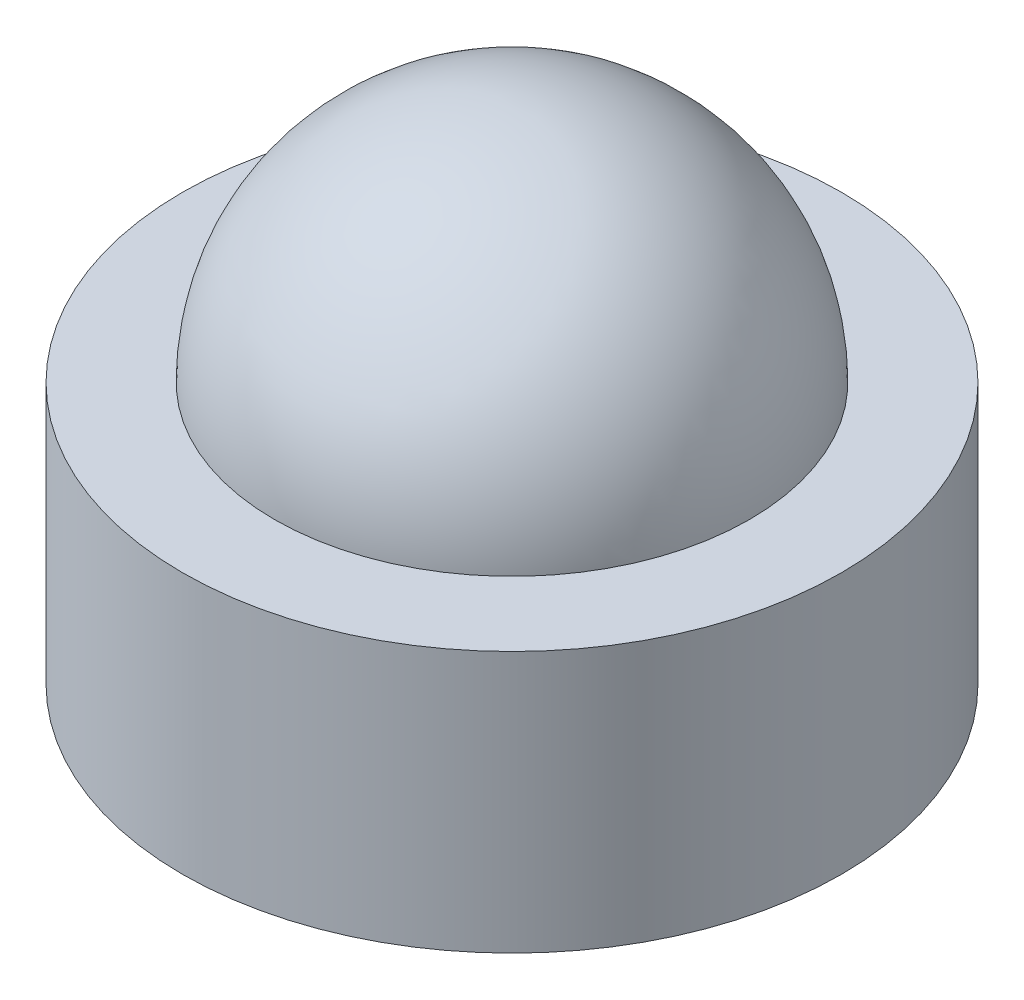
ISO-10303-21;
HEADER;
FILE_DESCRIPTION(('STEP AP214'),'2;1');
FILE_NAME('part.step','',(''),(''),'','','');
FILE_SCHEMA(('AUTOMOTIVE_DESIGN { 1 0 10303 214 1 1 1 1 }'));
ENDSEC;
DATA;
#1=APPLICATION_CONTEXT('core data for automotive mechanical design processes');
#2=APPLICATION_PROTOCOL_DEFINITION('international standard','automotive_design',2000,#1);
#3=PRODUCT_CONTEXT('',#1,'mechanical');
#4=PRODUCT('Part','Part','',(#3));
#5=PRODUCT_RELATED_PRODUCT_CATEGORY('part','',(#4));
#6=PRODUCT_DEFINITION_FORMATION('','',#4);
#7=PRODUCT_DEFINITION_CONTEXT('part definition',#1,'design');
#8=PRODUCT_DEFINITION('design','',#6,#7);
#9=PRODUCT_DEFINITION_SHAPE('','',#8);
#10=(LENGTH_UNIT() NAMED_UNIT(*) SI_UNIT(.MILLI.,.METRE.));
#11=(NAMED_UNIT(*) PLANE_ANGLE_UNIT() SI_UNIT($,.RADIAN.));
#12=(NAMED_UNIT(*) SI_UNIT($,.STERADIAN.) SOLID_ANGLE_UNIT());
#13=UNCERTAINTY_MEASURE_WITH_UNIT(LENGTH_MEASURE(1.E-05),#10,'distance_accuracy_value','');
#14=(GEOMETRIC_REPRESENTATION_CONTEXT(3) GLOBAL_UNCERTAINTY_ASSIGNED_CONTEXT((#13)) GLOBAL_UNIT_ASSIGNED_CONTEXT((#10,
#11,#12)) REPRESENTATION_CONTEXT('',''));
#15=CARTESIAN_POINT('',(0.,0.,0.));
#16=DIRECTION('',(0.,0.,1.));
#17=DIRECTION('',(1.,0.,0.));
#18=AXIS2_PLACEMENT_3D('',#15,#16,#17);
#19=CARTESIAN_POINT('',(0.,44.,0.));
#20=DIRECTION('',(0.,-1.,0.));
#21=DIRECTION('',(0.,0.,-1.));
#22=AXIS2_PLACEMENT_3D('',#19,#20,#21);
#23=CYLINDRICAL_SURFACE('',#22,55.5);
#24=CARTESIAN_POINT('',(0.,44.,0.));
#25=DIRECTION('',(0.,1.,0.));
#26=DIRECTION('',(0.,0.,1.));
#27=AXIS2_PLACEMENT_3D('',#24,#25,#26);
#28=CIRCLE('',#27,55.5);
#29=CARTESIAN_POINT('',(0.,44.,55.5));
#30=VERTEX_POINT('',#29);
#31=EDGE_CURVE('E10',#30,#30,#28,.T.);
#32=ORIENTED_EDGE('',*,*,#31,.F.);
#33=EDGE_LOOP('',(#32));
#34=FACE_BOUND('',#33,.T.);
#35=CARTESIAN_POINT('',(0.,0.,0.));
#36=DIRECTION('',(0.,1.,0.));
#37=DIRECTION('',(0.,0.,1.));
#38=AXIS2_PLACEMENT_3D('',#35,#36,#37);
#39=CIRCLE('',#38,55.5);
#40=CARTESIAN_POINT('',(0.,0.,55.5));
#41=VERTEX_POINT('',#40);
#42=EDGE_CURVE('E34',#41,#41,#39,.T.);
#43=ORIENTED_EDGE('',*,*,#42,.T.);
#44=EDGE_LOOP('',(#43));
#45=FACE_BOUND('',#44,.T.);
#46=ADVANCED_FACE('F31',(#34,#45),#23,.T.);
#47=CARTESIAN_POINT('',(0.,44.,0.));
#48=DIRECTION('',(0.,1.,0.));
#49=DIRECTION('',(0.,0.,1.));
#50=AXIS2_PLACEMENT_3D('',#47,#48,#49);
#51=PLANE('',#50);
#52=CARTESIAN_POINT('',(0.,44.,0.));
#53=DIRECTION('',(0.,-1.,0.));
#54=DIRECTION('',(1.,0.,0.));
#55=AXIS2_PLACEMENT_3D('',#52,#53,#54);
#56=CIRCLE('',#55,40.);
#57=CARTESIAN_POINT('',(40.,44.,0.));
#58=VERTEX_POINT('',#57);
#59=EDGE_CURVE('E41',#58,#58,#56,.T.);
#60=ORIENTED_EDGE('',*,*,#59,.T.);
#61=EDGE_LOOP('',(#60));
#62=FACE_BOUND('',#61,.T.);
#63=ORIENTED_EDGE('',*,*,#31,.T.);
#64=EDGE_LOOP('',(#63));
#65=FACE_BOUND('',#64,.T.);
#66=ADVANCED_FACE('F77',(#62,#65),#51,.T.);
#67=CARTESIAN_POINT('',(0.,0.,0.));
#68=DIRECTION('',(0.,1.,0.));
#69=DIRECTION('',(0.,0.,1.));
#70=AXIS2_PLACEMENT_3D('',#67,#68,#69);
#71=PLANE('',#70);
#72=CARTESIAN_POINT('',(0.,0.,50.2));
#73=DIRECTION('',(0.,-1.,0.));
#74=DIRECTION('',(0.,0.,-1.));
#75=AXIS2_PLACEMENT_3D('',#72,#73,#74);
#76=CIRCLE('',#75,2.);
#77=CARTESIAN_POINT('',(0.,0.,48.2));
#78=VERTEX_POINT('',#77);
#79=EDGE_CURVE('E58',#78,#78,#76,.T.);
#80=ORIENTED_EDGE('',*,*,#79,.F.);
#81=EDGE_LOOP('',(#80));
#82=FACE_BOUND('',#81,.T.);
#83=CARTESIAN_POINT('',(43.474475269982,0.,-25.0999999999981));
#84=DIRECTION('',(0.,-1.,0.));
#85=DIRECTION('',(0.,0.,-1.));
#86=AXIS2_PLACEMENT_3D('',#83,#84,#85);
#87=CIRCLE('',#86,2.00000000000275);
#88=CARTESIAN_POINT('',(43.474475269982,0.,-27.1000000000009));
#89=VERTEX_POINT('',#88);
#90=EDGE_CURVE('E52',#89,#89,#87,.T.);
#91=ORIENTED_EDGE('',*,*,#90,.F.);
#92=EDGE_LOOP('',(#91));
#93=FACE_BOUND('',#92,.T.);
#94=CARTESIAN_POINT('',(-43.4744752699756,0.,-25.1000000000019));
#95=DIRECTION('',(0.,-1.,0.));
#96=DIRECTION('',(0.,0.,-1.));
#97=AXIS2_PLACEMENT_3D('',#94,#95,#96);
#98=CIRCLE('',#97,2.00000000000407);
#99=CARTESIAN_POINT('',(-43.4744752699756,0.,-27.1000000000059));
#100=VERTEX_POINT('',#99);
#101=EDGE_CURVE('E46',#100,#100,#98,.T.);
#102=ORIENTED_EDGE('',*,*,#101,.F.);
#103=EDGE_LOOP('',(#102));
#104=FACE_BOUND('',#103,.T.);
#105=ORIENTED_EDGE('',*,*,#42,.F.);
#106=EDGE_LOOP('',(#105));
#107=FACE_BOUND('',#106,.T.);
#108=ADVANCED_FACE('F73',(#82,#93,#104,#107),#71,.F.);
#109=CARTESIAN_POINT('',(0.,44.,0.));
#110=DIRECTION('',(0.,-1.,0.));
#111=DIRECTION('',(-1.,0.,0.));
#112=AXIS2_PLACEMENT_3D('',#109,#110,#111);
#113=SPHERICAL_SURFACE('',#112,40.);
#114=ORIENTED_EDGE('',*,*,#59,.F.);
#115=EDGE_LOOP('',(#114));
#116=FACE_BOUND('',#115,.T.);
#117=ADVANCED_FACE('F76',(#116),#113,.T.);
#118=CARTESIAN_POINT('',(-43.4744752699756,4.,-25.1000000000019));
#119=DIRECTION('',(0.,-1.,0.));
#120=DIRECTION('',(0.,0.,-1.));
#121=AXIS2_PLACEMENT_3D('',#118,#119,#120);
#122=CYLINDRICAL_SURFACE('',#121,2.00000000000407);
#123=CARTESIAN_POINT('',(-43.4744752699756,4.,-25.1000000000019));
#124=DIRECTION('',(0.,-1.,0.));
#125=DIRECTION('',(0.,0.,-1.));
#126=AXIS2_PLACEMENT_3D('',#123,#124,#125);
#127=CIRCLE('',#126,2.00000000000407);
#128=CARTESIAN_POINT('',(-43.4744752699756,4.,-27.1000000000059));
#129=VERTEX_POINT('',#128);
#130=EDGE_CURVE('E49',#129,#129,#127,.T.);
#131=ORIENTED_EDGE('',*,*,#130,.F.);
#132=EDGE_LOOP('',(#131));
#133=FACE_BOUND('',#132,.T.);
#134=ORIENTED_EDGE('',*,*,#101,.T.);
#135=EDGE_LOOP('',(#134));
#136=FACE_BOUND('',#135,.T.);
#137=ADVANCED_FACE('F96',(#133,#136),#122,.F.);
#138=CARTESIAN_POINT('',(-43.4744752699756,4.,-25.1000000000019));
#139=DIRECTION('',(0.,-1.,0.));
#140=DIRECTION('',(0.,0.,-1.));
#141=AXIS2_PLACEMENT_3D('',#138,#139,#140);
#142=PLANE('',#141);
#143=ORIENTED_EDGE('',*,*,#130,.T.);
#144=EDGE_LOOP('',(#143));
#145=FACE_BOUND('',#144,.T.);
#146=ADVANCED_FACE('F100',(#145),#142,.T.);
#147=CARTESIAN_POINT('',(43.474475269982,4.,-25.0999999999981));
#148=DIRECTION('',(0.,-1.,0.));
#149=DIRECTION('',(0.,0.,-1.));
#150=AXIS2_PLACEMENT_3D('',#147,#148,#149);
#151=CYLINDRICAL_SURFACE('',#150,2.00000000000275);
#152=CARTESIAN_POINT('',(43.474475269982,4.,-25.0999999999981));
#153=DIRECTION('',(0.,-1.,0.));
#154=DIRECTION('',(0.,0.,-1.));
#155=AXIS2_PLACEMENT_3D('',#152,#153,#154);
#156=CIRCLE('',#155,2.00000000000275);
#157=CARTESIAN_POINT('',(43.474475269982,4.,-27.1000000000009));
#158=VERTEX_POINT('',#157);
#159=EDGE_CURVE('E55',#158,#158,#156,.T.);
#160=ORIENTED_EDGE('',*,*,#159,.F.);
#161=EDGE_LOOP('',(#160));
#162=FACE_BOUND('',#161,.T.);
#163=ORIENTED_EDGE('',*,*,#90,.T.);
#164=EDGE_LOOP('',(#163));
#165=FACE_BOUND('',#164,.T.);
#166=ADVANCED_FACE('F104',(#162,#165),#151,.F.);
#167=CARTESIAN_POINT('',(43.474475269982,4.,-25.0999999999981));
#168=DIRECTION('',(0.,-1.,0.));
#169=DIRECTION('',(0.,0.,-1.));
#170=AXIS2_PLACEMENT_3D('',#167,#168,#169);
#171=PLANE('',#170);
#172=ORIENTED_EDGE('',*,*,#159,.T.);
#173=EDGE_LOOP('',(#172));
#174=FACE_BOUND('',#173,.T.);
#175=ADVANCED_FACE('F69',(#174),#171,.T.);
#176=CARTESIAN_POINT('',(0.,4.,50.2));
#177=DIRECTION('',(0.,-1.,0.));
#178=DIRECTION('',(0.,0.,-1.));
#179=AXIS2_PLACEMENT_3D('',#176,#177,#178);
#180=CYLINDRICAL_SURFACE('',#179,2.);
#181=CARTESIAN_POINT('',(0.,4.,50.2));
#182=DIRECTION('',(0.,-1.,0.));
#183=DIRECTION('',(0.,0.,-1.));
#184=AXIS2_PLACEMENT_3D('',#181,#182,#183);
#185=CIRCLE('',#184,2.);
#186=CARTESIAN_POINT('',(0.,4.,48.2));
#187=VERTEX_POINT('',#186);
#188=EDGE_CURVE('E45',#187,#187,#185,.T.);
#189=ORIENTED_EDGE('',*,*,#188,.F.);
#190=EDGE_LOOP('',(#189));
#191=FACE_BOUND('',#190,.T.);
#192=ORIENTED_EDGE('',*,*,#79,.T.);
#193=EDGE_LOOP('',(#192));
#194=FACE_BOUND('',#193,.T.);
#195=ADVANCED_FACE('F66',(#191,#194),#180,.F.);
#196=CARTESIAN_POINT('',(0.,4.,50.2));
#197=DIRECTION('',(0.,-1.,0.));
#198=DIRECTION('',(0.,0.,-1.));
#199=AXIS2_PLACEMENT_3D('',#196,#197,#198);
#200=PLANE('',#199);
#201=ORIENTED_EDGE('',*,*,#188,.T.);
#202=EDGE_LOOP('',(#201));
#203=FACE_BOUND('',#202,.T.);
#204=ADVANCED_FACE('F64',(#203),#200,.T.);
#205=CLOSED_SHELL('',(#46,#66,#108,#117,#137,#146,#166,#175,#195,#204));
#206=MANIFOLD_SOLID_BREP('B2',#205);
#207=ADVANCED_BREP_SHAPE_REPRESENTATION('',(#18,#206),#14);
#208=SHAPE_DEFINITION_REPRESENTATION(#9,#207);
ENDSEC;
END-ISO-10303-21;
